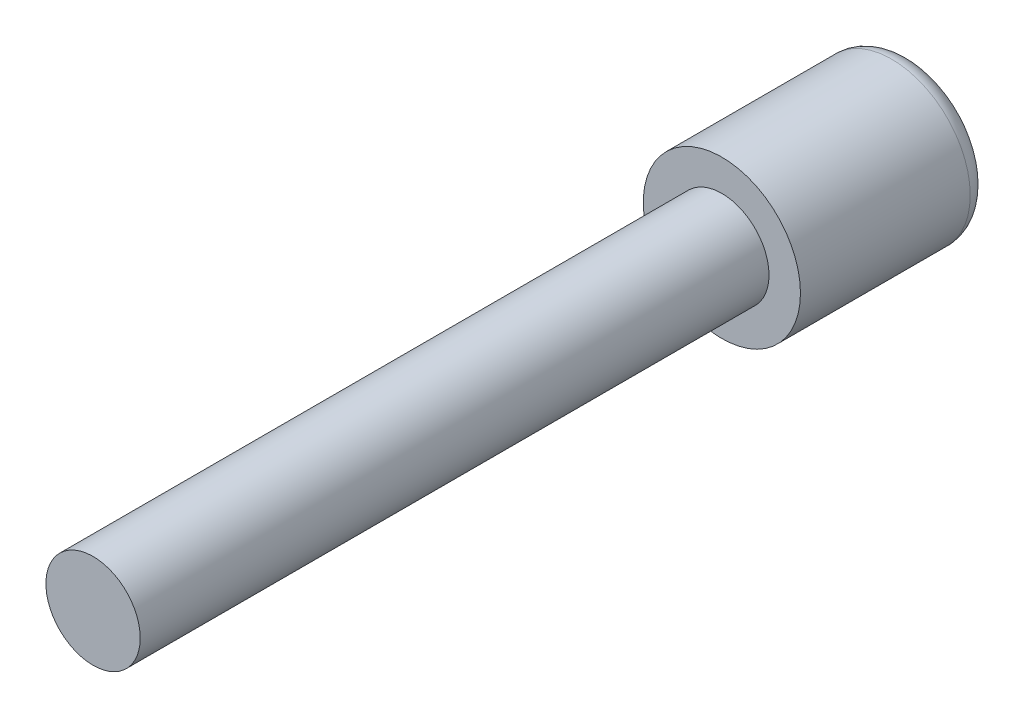
ISO-10303-21;
HEADER;
FILE_DESCRIPTION(('STEP AP214'),'2;1');
FILE_NAME('part.step','',(''),(''),'','','');
FILE_SCHEMA(('AUTOMOTIVE_DESIGN { 1 0 10303 214 1 1 1 1 }'));
ENDSEC;
DATA;
#1=APPLICATION_CONTEXT('core data for automotive mechanical design processes');
#2=APPLICATION_PROTOCOL_DEFINITION('international standard','automotive_design',2000,#1);
#3=PRODUCT_CONTEXT('',#1,'mechanical');
#4=PRODUCT('Part','Part','',(#3));
#5=PRODUCT_RELATED_PRODUCT_CATEGORY('part','',(#4));
#6=PRODUCT_DEFINITION_FORMATION('','',#4);
#7=PRODUCT_DEFINITION_CONTEXT('part definition',#1,'design');
#8=PRODUCT_DEFINITION('design','',#6,#7);
#9=PRODUCT_DEFINITION_SHAPE('','',#8);
#10=(LENGTH_UNIT() NAMED_UNIT(*) SI_UNIT(.MILLI.,.METRE.));
#11=(NAMED_UNIT(*) PLANE_ANGLE_UNIT() SI_UNIT($,.RADIAN.));
#12=(NAMED_UNIT(*) SI_UNIT($,.STERADIAN.) SOLID_ANGLE_UNIT());
#13=UNCERTAINTY_MEASURE_WITH_UNIT(LENGTH_MEASURE(1.E-05),#10,'distance_accuracy_value','');
#14=(GEOMETRIC_REPRESENTATION_CONTEXT(3) GLOBAL_UNCERTAINTY_ASSIGNED_CONTEXT((#13)) GLOBAL_UNIT_ASSIGNED_CONTEXT((#10,
#11,#12)) REPRESENTATION_CONTEXT('',''));
#15=CARTESIAN_POINT('',(0.,0.,0.));
#16=DIRECTION('',(0.,0.,1.));
#17=DIRECTION('',(1.,0.,0.));
#18=AXIS2_PLACEMENT_3D('',#15,#16,#17);
#19=CARTESIAN_POINT('',(0.,0.,3.));
#20=DIRECTION('',(0.,0.,-1.));
#21=DIRECTION('',(-1.,0.,0.));
#22=AXIS2_PLACEMENT_3D('',#19,#20,#21);
#23=CYLINDRICAL_SURFACE('',#22,1.25);
#24=CARTESIAN_POINT('',(0.,0.,0.3));
#25=DIRECTION('',(0.,0.,1.));
#26=DIRECTION('',(1.,0.,0.));
#27=AXIS2_PLACEMENT_3D('',#24,#25,#26);
#28=CIRCLE('',#27,1.25);
#29=CARTESIAN_POINT('',(1.25,0.,0.3));
#30=VERTEX_POINT('',#29);
#31=EDGE_CURVE('E45',#30,#30,#28,.T.);
#32=ORIENTED_EDGE('',*,*,#31,.T.);
#33=EDGE_LOOP('',(#32));
#34=FACE_BOUND('',#33,.T.);
#35=CARTESIAN_POINT('',(0.,0.,3.));
#36=DIRECTION('',(0.,0.,1.));
#37=DIRECTION('',(1.,0.,0.));
#38=AXIS2_PLACEMENT_3D('',#35,#36,#37);
#39=CIRCLE('',#38,1.25);
#40=CARTESIAN_POINT('',(1.25,0.,3.));
#41=VERTEX_POINT('',#40);
#42=EDGE_CURVE('E55',#41,#41,#39,.T.);
#43=ORIENTED_EDGE('',*,*,#42,.F.);
#44=EDGE_LOOP('',(#43));
#45=FACE_BOUND('',#44,.T.);
#46=ADVANCED_FACE('F37',(#34,#45),#23,.T.);
#47=CARTESIAN_POINT('',(0.,0.,3.));
#48=DIRECTION('',(0.,0.,1.));
#49=DIRECTION('',(1.,0.,0.));
#50=AXIS2_PLACEMENT_3D('',#47,#48,#49);
#51=PLANE('',#50);
#52=CARTESIAN_POINT('',(0.,0.,3.));
#53=DIRECTION('',(0.,0.,1.));
#54=DIRECTION('',(1.,0.,0.));
#55=AXIS2_PLACEMENT_3D('',#52,#53,#54);
#56=CIRCLE('',#55,0.75);
#57=CARTESIAN_POINT('',(0.75,0.,3.));
#58=VERTEX_POINT('',#57);
#59=EDGE_CURVE('E50',#58,#58,#56,.T.);
#60=ORIENTED_EDGE('',*,*,#59,.F.);
#61=EDGE_LOOP('',(#60));
#62=FACE_BOUND('',#61,.T.);
#63=ORIENTED_EDGE('',*,*,#42,.T.);
#64=EDGE_LOOP('',(#63));
#65=FACE_BOUND('',#64,.T.);
#66=ADVANCED_FACE('F75',(#62,#65),#51,.T.);
#67=CARTESIAN_POINT('',(0.,0.,0.));
#68=DIRECTION('',(0.,0.,1.));
#69=DIRECTION('',(1.,0.,0.));
#70=AXIS2_PLACEMENT_3D('',#67,#68,#69);
#71=PLANE('',#70);
#72=CARTESIAN_POINT('',(0.,0.,0.));
#73=DIRECTION('',(0.,0.,1.));
#74=DIRECTION('',(1.,0.,0.));
#75=AXIS2_PLACEMENT_3D('',#72,#73,#74);
#76=CIRCLE('',#75,0.95);
#77=CARTESIAN_POINT('',(0.95,0.,0.));
#78=VERTEX_POINT('',#77);
#79=EDGE_CURVE('E10',#78,#78,#76,.F.);
#80=ORIENTED_EDGE('',*,*,#79,.T.);
#81=EDGE_LOOP('',(#80));
#82=FACE_BOUND('',#81,.T.);
#83=ADVANCED_FACE('F71',(#82),#71,.F.);
#84=CARTESIAN_POINT('',(0.,0.,13.));
#85=DIRECTION('',(0.,0.,-1.));
#86=DIRECTION('',(-1.,0.,0.));
#87=AXIS2_PLACEMENT_3D('',#84,#85,#86);
#88=CYLINDRICAL_SURFACE('',#87,0.75);
#89=CARTESIAN_POINT('',(0.,0.,13.));
#90=DIRECTION('',(0.,0.,1.));
#91=DIRECTION('',(1.,0.,0.));
#92=AXIS2_PLACEMENT_3D('',#89,#90,#91);
#93=CIRCLE('',#92,0.75);
#94=CARTESIAN_POINT('',(0.75,0.,13.));
#95=VERTEX_POINT('',#94);
#96=EDGE_CURVE('E60',#95,#95,#93,.T.);
#97=ORIENTED_EDGE('',*,*,#96,.F.);
#98=EDGE_LOOP('',(#97));
#99=FACE_BOUND('',#98,.T.);
#100=ORIENTED_EDGE('',*,*,#59,.T.);
#101=EDGE_LOOP('',(#100));
#102=FACE_BOUND('',#101,.T.);
#103=ADVANCED_FACE('F68',(#99,#102),#88,.T.);
#104=CARTESIAN_POINT('',(0.,0.,13.));
#105=DIRECTION('',(0.,0.,1.));
#106=DIRECTION('',(1.,0.,0.));
#107=AXIS2_PLACEMENT_3D('',#104,#105,#106);
#108=PLANE('',#107);
#109=ORIENTED_EDGE('',*,*,#96,.T.);
#110=EDGE_LOOP('',(#109));
#111=FACE_BOUND('',#110,.T.);
#112=ADVANCED_FACE('F66',(#111),#108,.T.);
#113=CARTESIAN_POINT('',(0.,0.,0.3));
#114=DIRECTION('',(0.,0.,1.));
#115=DIRECTION('',(1.,0.,0.));
#116=AXIS2_PLACEMENT_3D('',#113,#114,#115);
#117=TOROIDAL_SURFACE('',#116,0.95,0.3);
#118=ORIENTED_EDGE('',*,*,#79,.F.);
#119=EDGE_LOOP('',(#118));
#120=FACE_BOUND('',#119,.T.);
#121=ORIENTED_EDGE('',*,*,#31,.F.);
#122=EDGE_LOOP('',(#121));
#123=FACE_BOUND('',#122,.T.);
#124=ADVANCED_FACE('F39',(#120,#123),#117,.T.);
#125=CLOSED_SHELL('',(#46,#66,#83,#103,#112,#124));
#126=MANIFOLD_SOLID_BREP('B2',#125);
#127=ADVANCED_BREP_SHAPE_REPRESENTATION('',(#18,#126),#14);
#128=SHAPE_DEFINITION_REPRESENTATION(#9,#127);
ENDSEC;
END-ISO-10303-21;
